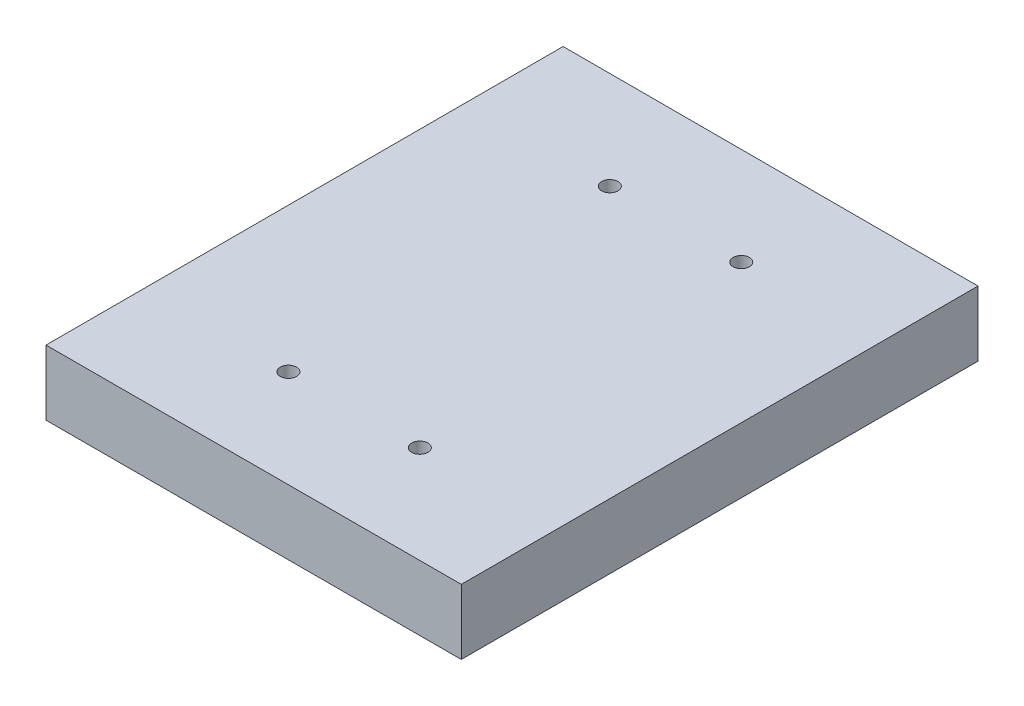
ISO-10303-21;
HEADER;
FILE_DESCRIPTION(('STEP AP214'),'2;1');
FILE_NAME('part.step','',(''),(''),'','','');
FILE_SCHEMA(('AUTOMOTIVE_DESIGN { 1 0 10303 214 1 1 1 1 }'));
ENDSEC;
DATA;
#1=APPLICATION_CONTEXT('core data for automotive mechanical design processes');
#2=APPLICATION_PROTOCOL_DEFINITION('international standard','automotive_design',2000,#1);
#3=PRODUCT_CONTEXT('',#1,'mechanical');
#4=PRODUCT('Part','Part','',(#3));
#5=PRODUCT_RELATED_PRODUCT_CATEGORY('part','',(#4));
#6=PRODUCT_DEFINITION_FORMATION('','',#4);
#7=PRODUCT_DEFINITION_CONTEXT('part definition',#1,'design');
#8=PRODUCT_DEFINITION('design','',#6,#7);
#9=PRODUCT_DEFINITION_SHAPE('','',#8);
#10=(LENGTH_UNIT() NAMED_UNIT(*) SI_UNIT(.MILLI.,.METRE.));
#11=(NAMED_UNIT(*) PLANE_ANGLE_UNIT() SI_UNIT($,.RADIAN.));
#12=(NAMED_UNIT(*) SI_UNIT($,.STERADIAN.) SOLID_ANGLE_UNIT());
#13=UNCERTAINTY_MEASURE_WITH_UNIT(LENGTH_MEASURE(1.E-05),#10,'distance_accuracy_value','');
#14=(GEOMETRIC_REPRESENTATION_CONTEXT(3) GLOBAL_UNCERTAINTY_ASSIGNED_CONTEXT((#13)) GLOBAL_UNIT_ASSIGNED_CONTEXT((#10,
#11,#12)) REPRESENTATION_CONTEXT('',''));
#15=CARTESIAN_POINT('',(0.,0.,0.));
#16=DIRECTION('',(0.,0.,1.));
#17=DIRECTION('',(1.,0.,0.));
#18=AXIS2_PLACEMENT_3D('',#15,#16,#17);
#19=CARTESIAN_POINT('',(-13.8871682771828,-10.,-30.4965763973358));
#20=DIRECTION('',(0.,1.,0.));
#21=DIRECTION('',(0.,0.,1.));
#22=AXIS2_PLACEMENT_3D('',#19,#20,#21);
#23=CYLINDRICAL_SURFACE('',#22,1.25);
#24=CARTESIAN_POINT('',(-13.8871682771828,0.,-30.4965763973358));
#25=DIRECTION('',(0.,1.,0.));
#26=DIRECTION('',(0.,0.,1.));
#27=AXIS2_PLACEMENT_3D('',#24,#25,#26);
#28=CIRCLE('',#27,1.25);
#29=CARTESIAN_POINT('',(-13.8871682771828,0.,-29.2465763973358));
#30=VERTEX_POINT('',#29);
#31=EDGE_CURVE('E111',#30,#30,#28,.T.);
#32=ORIENTED_EDGE('',*,*,#31,.T.);
#33=EDGE_LOOP('',(#32));
#34=FACE_BOUND('',#33,.T.);
#35=CARTESIAN_POINT('',(-13.8871682771828,-8.,-30.4965763973358));
#36=DIRECTION('',(0.,-1.,0.));
#37=DIRECTION('',(0.,0.,-1.));
#38=AXIS2_PLACEMENT_3D('',#35,#36,#37);
#39=CIRCLE('',#38,1.25);
#40=CARTESIAN_POINT('',(-13.8871682771828,-8.,-31.7465763973358));
#41=VERTEX_POINT('',#40);
#42=EDGE_CURVE('E38',#41,#41,#39,.F.);
#43=ORIENTED_EDGE('',*,*,#42,.F.);
#44=EDGE_LOOP('',(#43));
#45=FACE_BOUND('',#44,.T.);
#46=ADVANCED_FACE('F34',(#34,#45),#23,.F.);
#47=CARTESIAN_POINT('',(-34.0871682771828,-10.,18.9034236127665));
#48=DIRECTION('',(0.,1.,0.));
#49=DIRECTION('',(0.,0.,1.));
#50=AXIS2_PLACEMENT_3D('',#47,#48,#49);
#51=CYLINDRICAL_SURFACE('',#50,1.25);
#52=CARTESIAN_POINT('',(-34.0871682771828,0.,18.9034236127665));
#53=DIRECTION('',(0.,1.,0.));
#54=DIRECTION('',(0.,0.,1.));
#55=AXIS2_PLACEMENT_3D('',#52,#53,#54);
#56=CIRCLE('',#55,1.25);
#57=CARTESIAN_POINT('',(-34.0871682771828,0.,20.1534236127665));
#58=VERTEX_POINT('',#57);
#59=EDGE_CURVE('E104',#58,#58,#56,.T.);
#60=ORIENTED_EDGE('',*,*,#59,.T.);
#61=EDGE_LOOP('',(#60));
#62=FACE_BOUND('',#61,.T.);
#63=CARTESIAN_POINT('',(-34.0871682771828,-8.,18.9034236127665));
#64=DIRECTION('',(0.,-1.,0.));
#65=DIRECTION('',(0.,0.,-1.));
#66=AXIS2_PLACEMENT_3D('',#63,#64,#65);
#67=CIRCLE('',#66,1.25);
#68=CARTESIAN_POINT('',(-34.0871682771828,-8.,17.6534236127665));
#69=VERTEX_POINT('',#68);
#70=EDGE_CURVE('E128',#69,#69,#67,.F.);
#71=ORIENTED_EDGE('',*,*,#70,.F.);
#72=EDGE_LOOP('',(#71));
#73=FACE_BOUND('',#72,.T.);
#74=ADVANCED_FACE('F197',(#62,#73),#51,.F.);
#75=CARTESIAN_POINT('',(-34.0871682771828,-10.,-30.4965763973358));
#76=DIRECTION('',(0.,1.,0.));
#77=DIRECTION('',(0.,0.,1.));
#78=AXIS2_PLACEMENT_3D('',#75,#76,#77);
#79=CYLINDRICAL_SURFACE('',#78,1.25);
#80=CARTESIAN_POINT('',(-34.0871682771828,0.,-30.4965763973358));
#81=DIRECTION('',(0.,1.,0.));
#82=DIRECTION('',(0.,0.,1.));
#83=AXIS2_PLACEMENT_3D('',#80,#81,#82);
#84=CIRCLE('',#83,1.25);
#85=CARTESIAN_POINT('',(-34.0871682771828,0.,-29.2465763973358));
#86=VERTEX_POINT('',#85);
#87=EDGE_CURVE('E101',#86,#86,#84,.T.);
#88=ORIENTED_EDGE('',*,*,#87,.T.);
#89=EDGE_LOOP('',(#88));
#90=FACE_BOUND('',#89,.T.);
#91=CARTESIAN_POINT('',(-34.0871682771828,-8.,-30.4965763973358));
#92=DIRECTION('',(0.,-1.,0.));
#93=DIRECTION('',(0.,0.,-1.));
#94=AXIS2_PLACEMENT_3D('',#91,#92,#93);
#95=CIRCLE('',#94,1.25);
#96=CARTESIAN_POINT('',(-34.0871682771828,-8.,-31.7465763973358));
#97=VERTEX_POINT('',#96);
#98=EDGE_CURVE('E126',#97,#97,#95,.F.);
#99=ORIENTED_EDGE('',*,*,#98,.F.);
#100=EDGE_LOOP('',(#99));
#101=FACE_BOUND('',#100,.T.);
#102=ADVANCED_FACE('F36',(#90,#101),#79,.F.);
#103=CARTESIAN_POINT('',(-13.8871682771828,-10.,18.9034236127665));
#104=DIRECTION('',(0.,1.,0.));
#105=DIRECTION('',(0.,0.,1.));
#106=AXIS2_PLACEMENT_3D('',#103,#104,#105);
#107=CYLINDRICAL_SURFACE('',#106,1.25);
#108=CARTESIAN_POINT('',(-13.8871682771828,0.,18.9034236127665));
#109=DIRECTION('',(0.,1.,0.));
#110=DIRECTION('',(0.,0.,1.));
#111=AXIS2_PLACEMENT_3D('',#108,#109,#110);
#112=CIRCLE('',#111,1.25);
#113=CARTESIAN_POINT('',(-13.8871682771828,0.,20.1534236127665));
#114=VERTEX_POINT('',#113);
#115=EDGE_CURVE('E108',#114,#114,#112,.T.);
#116=ORIENTED_EDGE('',*,*,#115,.T.);
#117=EDGE_LOOP('',(#116));
#118=FACE_BOUND('',#117,.T.);
#119=CARTESIAN_POINT('',(-13.8871682771828,-8.,18.9034236127665));
#120=DIRECTION('',(0.,-1.,0.));
#121=DIRECTION('',(0.,0.,-1.));
#122=AXIS2_PLACEMENT_3D('',#119,#120,#121);
#123=CIRCLE('',#122,1.25);
#124=CARTESIAN_POINT('',(-13.8871682771828,-8.,17.6534236127665));
#125=VERTEX_POINT('',#124);
#126=EDGE_CURVE('E105',#125,#125,#123,.F.);
#127=ORIENTED_EDGE('',*,*,#126,.F.);
#128=EDGE_LOOP('',(#127));
#129=FACE_BOUND('',#128,.T.);
#130=ADVANCED_FACE('F209',(#118,#129),#107,.F.);
#131=CARTESIAN_POINT('',(7.49157494385324,-10.,0.));
#132=DIRECTION('',(-1.,0.,0.));
#133=DIRECTION('',(0.,0.,1.));
#134=AXIS2_PLACEMENT_3D('',#131,#132,#133);
#135=PLANE('',#134);
#136=DIRECTION('',(0.,0.,1.));
#137=VECTOR('',#136,1.);
#138=CARTESIAN_POINT('',(7.49157494385324,0.,0.));
#139=LINE('',#138,#137);
#140=CARTESIAN_POINT('',(7.49157494385323,0.,-45.4965763973358));
#141=VERTEX_POINT('',#140);
#142=CARTESIAN_POINT('',(7.49157494449341,0.,33.9068235626636));
#143=VERTEX_POINT('',#142);
#144=EDGE_CURVE('E114',#141,#143,#139,.T.);
#145=ORIENTED_EDGE('',*,*,#144,.T.);
#146=DIRECTION('',(0.,1.,0.));
#147=VECTOR('',#146,1.);
#148=CARTESIAN_POINT('',(7.49157494449341,-10.,33.9068235626636));
#149=LINE('',#148,#147);
#150=CARTESIAN_POINT('',(7.49157494449341,-10.,33.9068235626636));
#151=VERTEX_POINT('',#150);
#152=EDGE_CURVE('E11',#151,#143,#149,.T.);
#153=ORIENTED_EDGE('',*,*,#152,.F.);
#154=DIRECTION('',(0.,0.,1.));
#155=VECTOR('',#154,1.);
#156=CARTESIAN_POINT('',(7.49157494385324,-10.,0.));
#157=LINE('',#156,#155);
#158=CARTESIAN_POINT('',(7.49157494385323,-10.,-45.4965763973358));
#159=VERTEX_POINT('',#158);
#160=EDGE_CURVE('E53',#159,#151,#157,.T.);
#161=ORIENTED_EDGE('',*,*,#160,.F.);
#162=DIRECTION('',(0.,1.,0.));
#163=VECTOR('',#162,1.);
#164=CARTESIAN_POINT('',(7.49157494385323,-10.,-45.4965763973358));
#165=LINE('',#164,#163);
#166=EDGE_CURVE('E81',#159,#141,#165,.T.);
#167=ORIENTED_EDGE('',*,*,#166,.T.);
#168=EDGE_LOOP('',(#145,#153,#161,#167));
#169=FACE_BOUND('',#168,.T.);
#170=ADVANCED_FACE('F207',(#169),#135,.F.);
#171=CARTESIAN_POINT('',(0.0346942814198973,-10.,33.9144519069738));
#172=DIRECTION('',(0.00102299348257207,0.,0.99999947674203));
#173=DIRECTION('',(0.99999947674203,0.,-0.00102299348257207));
#174=AXIS2_PLACEMENT_3D('',#171,#172,#173);
#175=PLANE('',#174);
#176=DIRECTION('',(0.999999476742031,0.,-0.00102299348257207));
#177=VECTOR('',#176,1.);
#178=CARTESIAN_POINT('',(0.0346942814198973,0.,33.9144519069738));
#179=LINE('',#178,#177);
#180=CARTESIAN_POINT('',(-56.2671682641849,0.,33.9720483755524));
#181=VERTEX_POINT('',#180);
#182=EDGE_CURVE('E96',#181,#143,#179,.T.);
#183=ORIENTED_EDGE('',*,*,#182,.F.);
#184=DIRECTION('',(0.,1.,0.));
#185=VECTOR('',#184,1.);
#186=CARTESIAN_POINT('',(-56.2671682641849,-10.,33.9720483755524));
#187=LINE('',#186,#185);
#188=CARTESIAN_POINT('',(-56.2671682641849,-10.,33.9720483755524));
#189=VERTEX_POINT('',#188);
#190=EDGE_CURVE('E44',#189,#181,#187,.T.);
#191=ORIENTED_EDGE('',*,*,#190,.F.);
#192=DIRECTION('',(0.999999476742031,0.,-0.00102299348257207));
#193=VECTOR('',#192,1.);
#194=CARTESIAN_POINT('',(0.0346942814198973,-10.,33.9144519069738));
#195=LINE('',#194,#193);
#196=EDGE_CURVE('E92',#189,#151,#195,.T.);
#197=ORIENTED_EDGE('',*,*,#196,.T.);
#198=ORIENTED_EDGE('',*,*,#152,.T.);
#199=EDGE_LOOP('',(#183,#191,#197,#198));
#200=FACE_BOUND('',#199,.T.);
#201=ADVANCED_FACE('F216',(#200),#175,.T.);
#202=CARTESIAN_POINT('',(-56.2671682641849,-10.,0.));
#203=DIRECTION('',(-1.,0.,0.));
#204=DIRECTION('',(0.,0.,1.));
#205=AXIS2_PLACEMENT_3D('',#202,#203,#204);
#206=PLANE('',#205);
#207=DIRECTION('',(0.,0.,1.));
#208=VECTOR('',#207,1.);
#209=CARTESIAN_POINT('',(-56.2671682641849,0.,0.));
#210=LINE('',#209,#208);
#211=CARTESIAN_POINT('',(-56.2671682641849,0.,-45.4965763973358));
#212=VERTEX_POINT('',#211);
#213=EDGE_CURVE('E87',#212,#181,#210,.T.);
#214=ORIENTED_EDGE('',*,*,#213,.F.);
#215=DIRECTION('',(0.,1.,0.));
#216=VECTOR('',#215,1.);
#217=CARTESIAN_POINT('',(-56.2671682641849,-10.,-45.4965763973358));
#218=LINE('',#217,#216);
#219=CARTESIAN_POINT('',(-56.2671682641849,-10.,-45.4965763973358));
#220=VERTEX_POINT('',#219);
#221=EDGE_CURVE('E83',#220,#212,#218,.T.);
#222=ORIENTED_EDGE('',*,*,#221,.F.);
#223=DIRECTION('',(0.,0.,1.));
#224=VECTOR('',#223,1.);
#225=CARTESIAN_POINT('',(-56.2671682641849,-10.,0.));
#226=LINE('',#225,#224);
#227=EDGE_CURVE('E86',#220,#189,#226,.T.);
#228=ORIENTED_EDGE('',*,*,#227,.T.);
#229=ORIENTED_EDGE('',*,*,#190,.T.);
#230=EDGE_LOOP('',(#214,#222,#228,#229));
#231=FACE_BOUND('',#230,.T.);
#232=ADVANCED_FACE('F85',(#231),#206,.T.);
#233=CARTESIAN_POINT('',(0.,-10.,-45.4965763973358));
#234=DIRECTION('',(0.,0.,-1.));
#235=DIRECTION('',(-1.,0.,0.));
#236=AXIS2_PLACEMENT_3D('',#233,#234,#235);
#237=PLANE('',#236);
#238=DIRECTION('',(-1.,0.,0.));
#239=VECTOR('',#238,1.);
#240=CARTESIAN_POINT('',(0.,0.,-45.4965763973358));
#241=LINE('',#240,#239);
#242=EDGE_CURVE('E116',#141,#212,#241,.T.);
#243=ORIENTED_EDGE('',*,*,#242,.F.);
#244=ORIENTED_EDGE('',*,*,#166,.F.);
#245=DIRECTION('',(-1.,0.,0.));
#246=VECTOR('',#245,1.);
#247=CARTESIAN_POINT('',(0.,-10.,-45.4965763973358));
#248=LINE('',#247,#246);
#249=EDGE_CURVE('E91',#159,#220,#248,.T.);
#250=ORIENTED_EDGE('',*,*,#249,.T.);
#251=ORIENTED_EDGE('',*,*,#221,.T.);
#252=EDGE_LOOP('',(#243,#244,#250,#251));
#253=FACE_BOUND('',#252,.T.);
#254=ADVANCED_FACE('F94',(#253),#237,.T.);
#255=CARTESIAN_POINT('',(0.,-10.,0.));
#256=DIRECTION('',(0.,1.,0.));
#257=DIRECTION('',(0.,0.,1.));
#258=AXIS2_PLACEMENT_3D('',#255,#256,#257);
#259=PLANE('',#258);
#260=CARTESIAN_POINT('',(-34.0871682771828,-10.,18.9034236127665));
#261=DIRECTION('',(0.,-1.,0.));
#262=DIRECTION('',(0.,0.,-1.));
#263=AXIS2_PLACEMENT_3D('',#260,#261,#262);
#264=CIRCLE('',#263,2.5);
#265=CARTESIAN_POINT('',(-34.0871682771828,-10.,16.4034236127665));
#266=VERTEX_POINT('',#265);
#267=EDGE_CURVE('E155',#266,#266,#264,.T.);
#268=ORIENTED_EDGE('',*,*,#267,.F.);
#269=EDGE_LOOP('',(#268));
#270=FACE_BOUND('',#269,.T.);
#271=CARTESIAN_POINT('',(-13.8871682771828,-10.,-30.4965763973358));
#272=DIRECTION('',(0.,-1.,0.));
#273=DIRECTION('',(0.,0.,-1.));
#274=AXIS2_PLACEMENT_3D('',#271,#272,#273);
#275=CIRCLE('',#274,2.5);
#276=CARTESIAN_POINT('',(-13.8871682771828,-10.,-32.9965763973358));
#277=VERTEX_POINT('',#276);
#278=EDGE_CURVE('E149',#277,#277,#275,.T.);
#279=ORIENTED_EDGE('',*,*,#278,.F.);
#280=EDGE_LOOP('',(#279));
#281=FACE_BOUND('',#280,.T.);
#282=CARTESIAN_POINT('',(-34.0871682771828,-10.,-30.4965763973358));
#283=DIRECTION('',(0.,-1.,0.));
#284=DIRECTION('',(0.,0.,-1.));
#285=AXIS2_PLACEMENT_3D('',#282,#283,#284);
#286=CIRCLE('',#285,2.5);
#287=CARTESIAN_POINT('',(-34.0871682771828,-10.,-32.9965763973358));
#288=VERTEX_POINT('',#287);
#289=EDGE_CURVE('E143',#288,#288,#286,.T.);
#290=ORIENTED_EDGE('',*,*,#289,.F.);
#291=EDGE_LOOP('',(#290));
#292=FACE_BOUND('',#291,.T.);
#293=CARTESIAN_POINT('',(-13.8871682771828,-10.,18.9034236127665));
#294=DIRECTION('',(0.,-1.,0.));
#295=DIRECTION('',(0.,0.,-1.));
#296=AXIS2_PLACEMENT_3D('',#293,#294,#295);
#297=CIRCLE('',#296,2.5);
#298=CARTESIAN_POINT('',(-13.8871682771828,-10.,16.4034236127665));
#299=VERTEX_POINT('',#298);
#300=EDGE_CURVE('E134',#299,#299,#297,.T.);
#301=ORIENTED_EDGE('',*,*,#300,.F.);
#302=EDGE_LOOP('',(#301));
#303=FACE_BOUND('',#302,.T.);
#304=ORIENTED_EDGE('',*,*,#160,.T.);
#305=ORIENTED_EDGE('',*,*,#196,.F.);
#306=ORIENTED_EDGE('',*,*,#227,.F.);
#307=ORIENTED_EDGE('',*,*,#249,.F.);
#308=EDGE_LOOP('',(#304,#305,#306,#307));
#309=FACE_BOUND('',#308,.T.);
#310=ADVANCED_FACE('F90',(#270,#281,#292,#303,#309),#259,.F.);
#311=CARTESIAN_POINT('',(0.,0.,0.));
#312=DIRECTION('',(0.,1.,0.));
#313=DIRECTION('',(0.,0.,1.));
#314=AXIS2_PLACEMENT_3D('',#311,#312,#313);
#315=PLANE('',#314);
#316=ORIENTED_EDGE('',*,*,#87,.F.);
#317=EDGE_LOOP('',(#316));
#318=FACE_BOUND('',#317,.T.);
#319=ORIENTED_EDGE('',*,*,#59,.F.);
#320=EDGE_LOOP('',(#319));
#321=FACE_BOUND('',#320,.T.);
#322=ORIENTED_EDGE('',*,*,#115,.F.);
#323=EDGE_LOOP('',(#322));
#324=FACE_BOUND('',#323,.T.);
#325=ORIENTED_EDGE('',*,*,#31,.F.);
#326=EDGE_LOOP('',(#325));
#327=FACE_BOUND('',#326,.T.);
#328=ORIENTED_EDGE('',*,*,#144,.F.);
#329=ORIENTED_EDGE('',*,*,#242,.T.);
#330=ORIENTED_EDGE('',*,*,#213,.T.);
#331=ORIENTED_EDGE('',*,*,#182,.T.);
#332=EDGE_LOOP('',(#328,#329,#330,#331));
#333=FACE_BOUND('',#332,.T.);
#334=ADVANCED_FACE('F171',(#318,#321,#324,#327,#333),#315,.T.);
#335=CARTESIAN_POINT('',(-13.8871682771828,-8.,18.9034236127665));
#336=DIRECTION('',(0.,-1.,0.));
#337=DIRECTION('',(0.,0.,-1.));
#338=AXIS2_PLACEMENT_3D('',#335,#336,#337);
#339=PLANE('',#338);
#340=CARTESIAN_POINT('',(-13.8871682771828,-8.,18.9034236127665));
#341=DIRECTION('',(0.,-1.,0.));
#342=DIRECTION('',(0.,0.,-1.));
#343=AXIS2_PLACEMENT_3D('',#340,#341,#342);
#344=CIRCLE('',#343,2.5);
#345=CARTESIAN_POINT('',(-13.8871682771828,-8.,16.4034236127665));
#346=VERTEX_POINT('',#345);
#347=EDGE_CURVE('E125',#346,#346,#344,.T.);
#348=ORIENTED_EDGE('',*,*,#347,.T.);
#349=EDGE_LOOP('',(#348));
#350=FACE_BOUND('',#349,.T.);
#351=ORIENTED_EDGE('',*,*,#126,.T.);
#352=EDGE_LOOP('',(#351));
#353=FACE_BOUND('',#352,.T.);
#354=ADVANCED_FACE('F223',(#350,#353),#339,.T.);
#355=CARTESIAN_POINT('',(-13.8871682771828,-8.,18.9034236127665));
#356=DIRECTION('',(0.,-1.,0.));
#357=DIRECTION('',(0.,0.,-1.));
#358=AXIS2_PLACEMENT_3D('',#355,#356,#357);
#359=CYLINDRICAL_SURFACE('',#358,2.5);
#360=ORIENTED_EDGE('',*,*,#347,.F.);
#361=EDGE_LOOP('',(#360));
#362=FACE_BOUND('',#361,.T.);
#363=ORIENTED_EDGE('',*,*,#300,.T.);
#364=EDGE_LOOP('',(#363));
#365=FACE_BOUND('',#364,.T.);
#366=ADVANCED_FACE('F191',(#362,#365),#359,.F.);
#367=CARTESIAN_POINT('',(-34.0871682771828,-8.,-30.4965763973358));
#368=DIRECTION('',(0.,-1.,0.));
#369=DIRECTION('',(0.,0.,-1.));
#370=AXIS2_PLACEMENT_3D('',#367,#368,#369);
#371=PLANE('',#370);
#372=CARTESIAN_POINT('',(-34.0871682771828,-8.,-30.4965763973358));
#373=DIRECTION('',(0.,-1.,0.));
#374=DIRECTION('',(0.,0.,-1.));
#375=AXIS2_PLACEMENT_3D('',#372,#373,#374);
#376=CIRCLE('',#375,2.5);
#377=CARTESIAN_POINT('',(-34.0871682771828,-8.,-32.9965763973358));
#378=VERTEX_POINT('',#377);
#379=EDGE_CURVE('E146',#378,#378,#376,.T.);
#380=ORIENTED_EDGE('',*,*,#379,.T.);
#381=EDGE_LOOP('',(#380));
#382=FACE_BOUND('',#381,.T.);
#383=ORIENTED_EDGE('',*,*,#98,.T.);
#384=EDGE_LOOP('',(#383));
#385=FACE_BOUND('',#384,.T.);
#386=ADVANCED_FACE('F181',(#382,#385),#371,.T.);
#387=CARTESIAN_POINT('',(-34.0871682771828,-8.,-30.4965763973358));
#388=DIRECTION('',(0.,-1.,0.));
#389=DIRECTION('',(0.,0.,-1.));
#390=AXIS2_PLACEMENT_3D('',#387,#388,#389);
#391=CYLINDRICAL_SURFACE('',#390,2.5);
#392=ORIENTED_EDGE('',*,*,#379,.F.);
#393=EDGE_LOOP('',(#392));
#394=FACE_BOUND('',#393,.T.);
#395=ORIENTED_EDGE('',*,*,#289,.T.);
#396=EDGE_LOOP('',(#395));
#397=FACE_BOUND('',#396,.T.);
#398=ADVANCED_FACE('F178',(#394,#397),#391,.F.);
#399=CARTESIAN_POINT('',(-13.8871682771828,-8.,-30.4965763973358));
#400=DIRECTION('',(0.,-1.,0.));
#401=DIRECTION('',(0.,0.,-1.));
#402=AXIS2_PLACEMENT_3D('',#399,#400,#401);
#403=PLANE('',#402);
#404=CARTESIAN_POINT('',(-13.8871682771828,-8.,-30.4965763973358));
#405=DIRECTION('',(0.,-1.,0.));
#406=DIRECTION('',(0.,0.,-1.));
#407=AXIS2_PLACEMENT_3D('',#404,#405,#406);
#408=CIRCLE('',#407,2.5);
#409=CARTESIAN_POINT('',(-13.8871682771828,-8.,-32.9965763973358));
#410=VERTEX_POINT('',#409);
#411=EDGE_CURVE('E152',#410,#410,#408,.T.);
#412=ORIENTED_EDGE('',*,*,#411,.T.);
#413=EDGE_LOOP('',(#412));
#414=FACE_BOUND('',#413,.T.);
#415=ORIENTED_EDGE('',*,*,#42,.T.);
#416=EDGE_LOOP('',(#415));
#417=FACE_BOUND('',#416,.T.);
#418=ADVANCED_FACE('F180',(#414,#417),#403,.T.);
#419=CARTESIAN_POINT('',(-13.8871682771828,-8.,-30.4965763973358));
#420=DIRECTION('',(0.,-1.,0.));
#421=DIRECTION('',(0.,0.,-1.));
#422=AXIS2_PLACEMENT_3D('',#419,#420,#421);
#423=CYLINDRICAL_SURFACE('',#422,2.5);
#424=ORIENTED_EDGE('',*,*,#411,.F.);
#425=EDGE_LOOP('',(#424));
#426=FACE_BOUND('',#425,.T.);
#427=ORIENTED_EDGE('',*,*,#278,.T.);
#428=EDGE_LOOP('',(#427));
#429=FACE_BOUND('',#428,.T.);
#430=ADVANCED_FACE('F188',(#426,#429),#423,.F.);
#431=CARTESIAN_POINT('',(-34.0871682771828,-8.,18.9034236127665));
#432=DIRECTION('',(0.,-1.,0.));
#433=DIRECTION('',(0.,0.,-1.));
#434=AXIS2_PLACEMENT_3D('',#431,#432,#433);
#435=PLANE('',#434);
#436=CARTESIAN_POINT('',(-34.0871682771828,-8.,18.9034236127665));
#437=DIRECTION('',(0.,-1.,0.));
#438=DIRECTION('',(0.,0.,-1.));
#439=AXIS2_PLACEMENT_3D('',#436,#437,#438);
#440=CIRCLE('',#439,2.5);
#441=CARTESIAN_POINT('',(-34.0871682771828,-8.,16.4034236127665));
#442=VERTEX_POINT('',#441);
#443=EDGE_CURVE('E129',#442,#442,#440,.T.);
#444=ORIENTED_EDGE('',*,*,#443,.T.);
#445=EDGE_LOOP('',(#444));
#446=FACE_BOUND('',#445,.T.);
#447=ORIENTED_EDGE('',*,*,#70,.T.);
#448=EDGE_LOOP('',(#447));
#449=FACE_BOUND('',#448,.T.);
#450=ADVANCED_FACE('F161',(#446,#449),#435,.T.);
#451=CARTESIAN_POINT('',(-34.0871682771828,-8.,18.9034236127665));
#452=DIRECTION('',(0.,-1.,0.));
#453=DIRECTION('',(0.,0.,-1.));
#454=AXIS2_PLACEMENT_3D('',#451,#452,#453);
#455=CYLINDRICAL_SURFACE('',#454,2.5);
#456=ORIENTED_EDGE('',*,*,#443,.F.);
#457=EDGE_LOOP('',(#456));
#458=FACE_BOUND('',#457,.T.);
#459=ORIENTED_EDGE('',*,*,#267,.T.);
#460=EDGE_LOOP('',(#459));
#461=FACE_BOUND('',#460,.T.);
#462=ADVANCED_FACE('F163',(#458,#461),#455,.F.);
#463=CLOSED_SHELL('',(#46,#74,#102,#130,#170,#201,#232,#254,#310,#334,#354,#366,#386,#398,#418,
#430,#450,#462));
#464=MANIFOLD_SOLID_BREP('B2',#463);
#465=ADVANCED_BREP_SHAPE_REPRESENTATION('',(#18,#464),#14);
#466=SHAPE_DEFINITION_REPRESENTATION(#9,#465);
ENDSEC;
END-ISO-10303-21;
